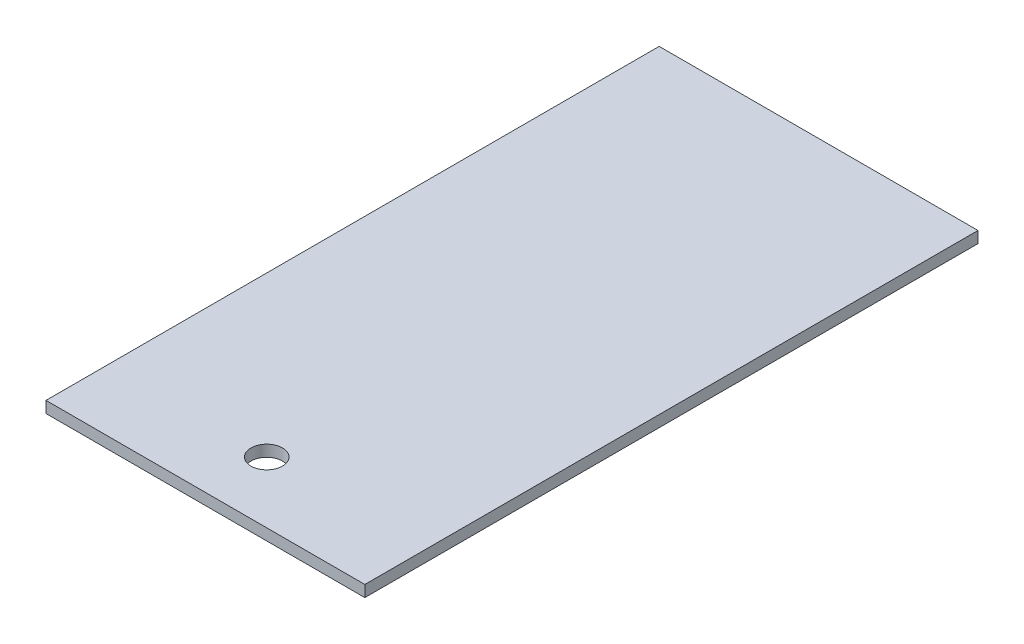
ISO-10303-21;
HEADER;
FILE_DESCRIPTION(('STEP AP214'),'2;1');
FILE_NAME('part.step','',(''),(''),'','','');
FILE_SCHEMA(('AUTOMOTIVE_DESIGN { 1 0 10303 214 1 1 1 1 }'));
ENDSEC;
DATA;
#1=APPLICATION_CONTEXT('core data for automotive mechanical design processes');
#2=APPLICATION_PROTOCOL_DEFINITION('international standard','automotive_design',2000,#1);
#3=PRODUCT_CONTEXT('',#1,'mechanical');
#4=PRODUCT('Part','Part','',(#3));
#5=PRODUCT_RELATED_PRODUCT_CATEGORY('part','',(#4));
#6=PRODUCT_DEFINITION_FORMATION('','',#4);
#7=PRODUCT_DEFINITION_CONTEXT('part definition',#1,'design');
#8=PRODUCT_DEFINITION('design','',#6,#7);
#9=PRODUCT_DEFINITION_SHAPE('','',#8);
#10=(LENGTH_UNIT() NAMED_UNIT(*) SI_UNIT(.MILLI.,.METRE.));
#11=(NAMED_UNIT(*) PLANE_ANGLE_UNIT() SI_UNIT($,.RADIAN.));
#12=(NAMED_UNIT(*) SI_UNIT($,.STERADIAN.) SOLID_ANGLE_UNIT());
#13=UNCERTAINTY_MEASURE_WITH_UNIT(LENGTH_MEASURE(1.E-05),#10,'distance_accuracy_value','');
#14=(GEOMETRIC_REPRESENTATION_CONTEXT(3) GLOBAL_UNCERTAINTY_ASSIGNED_CONTEXT((#13)) GLOBAL_UNIT_ASSIGNED_CONTEXT((#10,
#11,#12)) REPRESENTATION_CONTEXT('',''));
#15=CARTESIAN_POINT('',(0.,0.,0.));
#16=DIRECTION('',(0.,0.,1.));
#17=DIRECTION('',(1.,0.,0.));
#18=AXIS2_PLACEMENT_3D('',#15,#16,#17);
#19=CARTESIAN_POINT('',(0.,2.3622,0.));
#20=DIRECTION('',(1.,0.,0.));
#21=DIRECTION('',(0.,0.,-1.));
#22=AXIS2_PLACEMENT_3D('',#19,#20,#21);
#23=PLANE('',#22);
#24=DIRECTION('',(0.,0.,1.));
#25=VECTOR('',#24,1.);
#26=CARTESIAN_POINT('',(0.,0.,0.));
#27=LINE('',#26,#25);
#28=CARTESIAN_POINT('',(0.,0.,-127.));
#29=VERTEX_POINT('',#28);
#30=CARTESIAN_POINT('',(0.,0.,0.));
#31=VERTEX_POINT('',#30);
#32=EDGE_CURVE('E111',#29,#31,#27,.T.);
#33=ORIENTED_EDGE('',*,*,#32,.T.);
#34=DIRECTION('',(0.,-1.,0.));
#35=VECTOR('',#34,1.);
#36=CARTESIAN_POINT('',(0.,2.3622,0.));
#37=LINE('',#36,#35);
#38=CARTESIAN_POINT('',(0.,2.3622,0.));
#39=VERTEX_POINT('',#38);
#40=EDGE_CURVE('E11',#39,#31,#37,.T.);
#41=ORIENTED_EDGE('',*,*,#40,.F.);
#42=DIRECTION('',(0.,0.,1.));
#43=VECTOR('',#42,1.);
#44=CARTESIAN_POINT('',(0.,2.3622,0.));
#45=LINE('',#44,#43);
#46=CARTESIAN_POINT('',(0.,2.3622,-127.));
#47=VERTEX_POINT('',#46);
#48=EDGE_CURVE('E95',#47,#39,#45,.T.);
#49=ORIENTED_EDGE('',*,*,#48,.F.);
#50=DIRECTION('',(0.,-1.,0.));
#51=VECTOR('',#50,1.);
#52=CARTESIAN_POINT('',(0.,2.3622,-127.));
#53=LINE('',#52,#51);
#54=EDGE_CURVE('E107',#47,#29,#53,.T.);
#55=ORIENTED_EDGE('',*,*,#54,.T.);
#56=EDGE_LOOP('',(#33,#41,#49,#55));
#57=FACE_BOUND('',#56,.T.);
#58=ADVANCED_FACE('F43',(#57),#23,.F.);
#59=CARTESIAN_POINT('',(0.,2.3622,0.));
#60=DIRECTION('',(0.,0.,-1.));
#61=DIRECTION('',(-1.,0.,0.));
#62=AXIS2_PLACEMENT_3D('',#59,#60,#61);
#63=PLANE('',#62);
#64=DIRECTION('',(1.,0.,0.));
#65=VECTOR('',#64,1.);
#66=CARTESIAN_POINT('',(0.,0.,0.));
#67=LINE('',#66,#65);
#68=CARTESIAN_POINT('',(66.04,0.,0.));
#69=VERTEX_POINT('',#68);
#70=EDGE_CURVE('E100',#31,#69,#67,.T.);
#71=ORIENTED_EDGE('',*,*,#70,.T.);
#72=DIRECTION('',(0.,-1.,0.));
#73=VECTOR('',#72,1.);
#74=CARTESIAN_POINT('',(66.04,2.3622,0.));
#75=LINE('',#74,#73);
#76=CARTESIAN_POINT('',(66.04,2.3622,0.));
#77=VERTEX_POINT('',#76);
#78=EDGE_CURVE('E52',#77,#69,#75,.T.);
#79=ORIENTED_EDGE('',*,*,#78,.F.);
#80=DIRECTION('',(1.,0.,0.));
#81=VECTOR('',#80,1.);
#82=CARTESIAN_POINT('',(0.,2.3622,0.));
#83=LINE('',#82,#81);
#84=EDGE_CURVE('E90',#39,#77,#83,.T.);
#85=ORIENTED_EDGE('',*,*,#84,.F.);
#86=ORIENTED_EDGE('',*,*,#40,.T.);
#87=EDGE_LOOP('',(#71,#79,#85,#86));
#88=FACE_BOUND('',#87,.T.);
#89=ADVANCED_FACE('F99',(#88),#63,.F.);
#90=CARTESIAN_POINT('',(66.04,2.3622,0.));
#91=DIRECTION('',(-1.,0.,0.));
#92=DIRECTION('',(0.,0.,1.));
#93=AXIS2_PLACEMENT_3D('',#90,#91,#92);
#94=PLANE('',#93);
#95=DIRECTION('',(0.,0.,-1.));
#96=VECTOR('',#95,1.);
#97=CARTESIAN_POINT('',(66.04,0.,0.));
#98=LINE('',#97,#96);
#99=CARTESIAN_POINT('',(66.04,0.,-127.));
#100=VERTEX_POINT('',#99);
#101=EDGE_CURVE('E77',#69,#100,#98,.T.);
#102=ORIENTED_EDGE('',*,*,#101,.T.);
#103=DIRECTION('',(0.,-1.,0.));
#104=VECTOR('',#103,1.);
#105=CARTESIAN_POINT('',(66.04,2.3622,-127.));
#106=LINE('',#105,#104);
#107=CARTESIAN_POINT('',(66.04,2.3622,-127.));
#108=VERTEX_POINT('',#107);
#109=EDGE_CURVE('E102',#108,#100,#106,.T.);
#110=ORIENTED_EDGE('',*,*,#109,.F.);
#111=DIRECTION('',(0.,0.,-1.));
#112=VECTOR('',#111,1.);
#113=CARTESIAN_POINT('',(66.04,2.3622,0.));
#114=LINE('',#113,#112);
#115=EDGE_CURVE('E93',#77,#108,#114,.T.);
#116=ORIENTED_EDGE('',*,*,#115,.F.);
#117=ORIENTED_EDGE('',*,*,#78,.T.);
#118=EDGE_LOOP('',(#102,#110,#116,#117));
#119=FACE_BOUND('',#118,.T.);
#120=ADVANCED_FACE('F103',(#119),#94,.F.);
#121=CARTESIAN_POINT('',(0.,2.3622,-127.));
#122=DIRECTION('',(0.,0.,1.));
#123=DIRECTION('',(1.,0.,0.));
#124=AXIS2_PLACEMENT_3D('',#121,#122,#123);
#125=PLANE('',#124);
#126=DIRECTION('',(-1.,0.,0.));
#127=VECTOR('',#126,1.);
#128=CARTESIAN_POINT('',(0.,0.,-127.));
#129=LINE('',#128,#127);
#130=EDGE_CURVE('E83',#100,#29,#129,.T.);
#131=ORIENTED_EDGE('',*,*,#130,.T.);
#132=ORIENTED_EDGE('',*,*,#54,.F.);
#133=DIRECTION('',(-1.,0.,0.));
#134=VECTOR('',#133,1.);
#135=CARTESIAN_POINT('',(0.,2.3622,-127.));
#136=LINE('',#135,#134);
#137=EDGE_CURVE('E60',#108,#47,#136,.T.);
#138=ORIENTED_EDGE('',*,*,#137,.F.);
#139=ORIENTED_EDGE('',*,*,#109,.T.);
#140=EDGE_LOOP('',(#131,#132,#138,#139));
#141=FACE_BOUND('',#140,.T.);
#142=ADVANCED_FACE('F125',(#141),#125,.F.);
#143=CARTESIAN_POINT('',(0.,2.3622,0.));
#144=DIRECTION('',(0.,-1.,0.));
#145=DIRECTION('',(0.,0.,-1.));
#146=AXIS2_PLACEMENT_3D('',#143,#144,#145);
#147=PLANE('',#146);
#148=CARTESIAN_POINT('',(33.02,2.3622,-12.7));
#149=DIRECTION('',(0.,1.,0.));
#150=DIRECTION('',(0.,0.,1.));
#151=AXIS2_PLACEMENT_3D('',#148,#149,#150);
#152=CIRCLE('',#151,3.2639);
#153=CARTESIAN_POINT('',(33.02,2.3622,-9.4361));
#154=VERTEX_POINT('',#153);
#155=EDGE_CURVE('E132',#154,#154,#152,.T.);
#156=ORIENTED_EDGE('',*,*,#155,.F.);
#157=EDGE_LOOP('',(#156));
#158=FACE_BOUND('',#157,.T.);
#159=ORIENTED_EDGE('',*,*,#48,.T.);
#160=ORIENTED_EDGE('',*,*,#84,.T.);
#161=ORIENTED_EDGE('',*,*,#115,.T.);
#162=ORIENTED_EDGE('',*,*,#137,.T.);
#163=EDGE_LOOP('',(#159,#160,#161,#162));
#164=FACE_BOUND('',#163,.T.);
#165=ADVANCED_FACE('F91',(#158,#164),#147,.F.);
#166=CARTESIAN_POINT('',(0.,0.,0.));
#167=DIRECTION('',(0.,-1.,0.));
#168=DIRECTION('',(0.,0.,-1.));
#169=AXIS2_PLACEMENT_3D('',#166,#167,#168);
#170=PLANE('',#169);
#171=CARTESIAN_POINT('',(33.02,0.,-12.7));
#172=DIRECTION('',(0.,1.,0.));
#173=DIRECTION('',(0.,0.,1.));
#174=AXIS2_PLACEMENT_3D('',#171,#172,#173);
#175=CIRCLE('',#174,3.2639);
#176=CARTESIAN_POINT('',(33.02,0.,-9.4361));
#177=VERTEX_POINT('',#176);
#178=EDGE_CURVE('E115',#177,#177,#175,.T.);
#179=ORIENTED_EDGE('',*,*,#178,.T.);
#180=EDGE_LOOP('',(#179));
#181=FACE_BOUND('',#180,.T.);
#182=ORIENTED_EDGE('',*,*,#32,.F.);
#183=ORIENTED_EDGE('',*,*,#130,.F.);
#184=ORIENTED_EDGE('',*,*,#101,.F.);
#185=ORIENTED_EDGE('',*,*,#70,.F.);
#186=EDGE_LOOP('',(#182,#183,#184,#185));
#187=FACE_BOUND('',#186,.T.);
#188=ADVANCED_FACE('F128',(#181,#187),#170,.T.);
#189=CARTESIAN_POINT('',(33.02,0.,-12.7));
#190=DIRECTION('',(0.,1.,0.));
#191=DIRECTION('',(0.,0.,1.));
#192=AXIS2_PLACEMENT_3D('',#189,#190,#191);
#193=CYLINDRICAL_SURFACE('',#192,3.2639);
#194=ORIENTED_EDGE('',*,*,#178,.F.);
#195=EDGE_LOOP('',(#194));
#196=FACE_BOUND('',#195,.T.);
#197=ORIENTED_EDGE('',*,*,#155,.T.);
#198=EDGE_LOOP('',(#197));
#199=FACE_BOUND('',#198,.T.);
#200=ADVANCED_FACE('F141',(#196,#199),#193,.F.);
#201=CLOSED_SHELL('',(#58,#89,#120,#142,#165,#188,#200));
#202=MANIFOLD_SOLID_BREP('B2',#201);
#203=ADVANCED_BREP_SHAPE_REPRESENTATION('',(#18,#202),#14);
#204=SHAPE_DEFINITION_REPRESENTATION(#9,#203);
ENDSEC;
END-ISO-10303-21;
